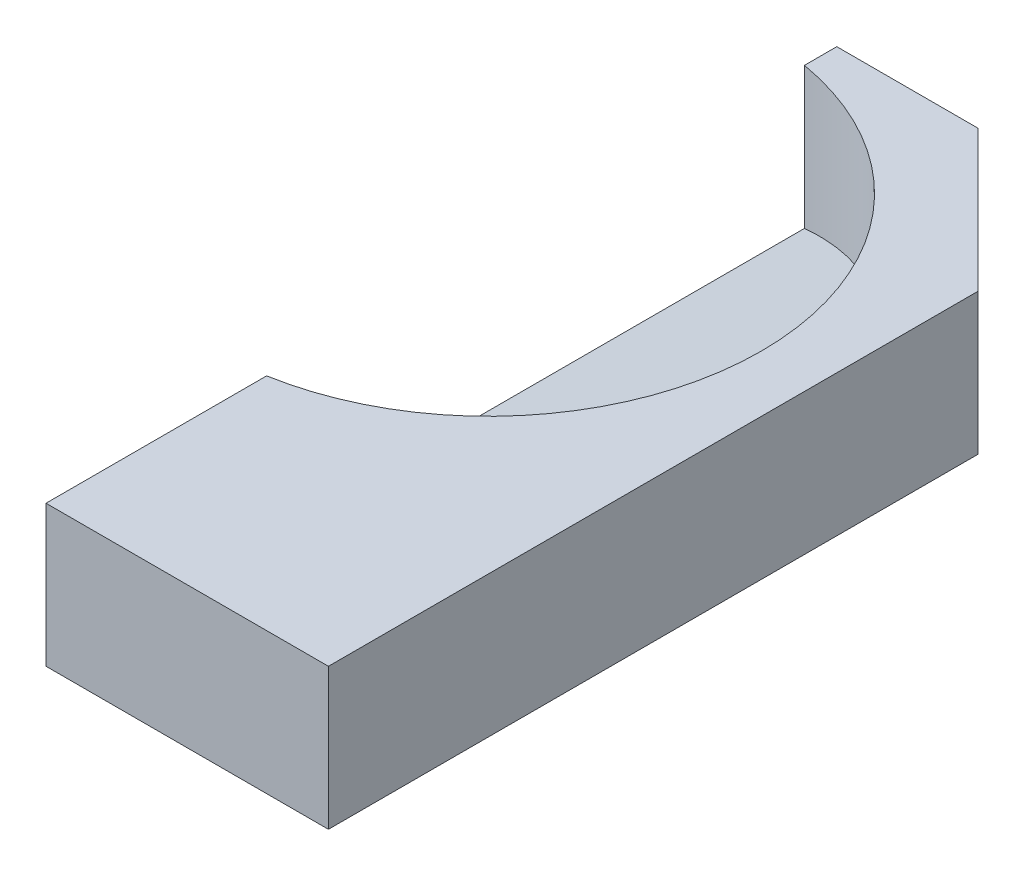
ISO-10303-21;
HEADER;
FILE_DESCRIPTION(('STEP AP214'),'2;1');
FILE_NAME('part.step','',(''),(''),'','','');
FILE_SCHEMA(('AUTOMOTIVE_DESIGN { 1 0 10303 214 1 1 1 1 }'));
ENDSEC;
DATA;
#1=APPLICATION_CONTEXT('core data for automotive mechanical design processes');
#2=APPLICATION_PROTOCOL_DEFINITION('international standard','automotive_design',2000,#1);
#3=PRODUCT_CONTEXT('',#1,'mechanical');
#4=PRODUCT('Part','Part','',(#3));
#5=PRODUCT_RELATED_PRODUCT_CATEGORY('part','',(#4));
#6=PRODUCT_DEFINITION_FORMATION('','',#4);
#7=PRODUCT_DEFINITION_CONTEXT('part definition',#1,'design');
#8=PRODUCT_DEFINITION('design','',#6,#7);
#9=PRODUCT_DEFINITION_SHAPE('','',#8);
#10=(LENGTH_UNIT() NAMED_UNIT(*) SI_UNIT(.MILLI.,.METRE.));
#11=(NAMED_UNIT(*) PLANE_ANGLE_UNIT() SI_UNIT($,.RADIAN.));
#12=(NAMED_UNIT(*) SI_UNIT($,.STERADIAN.) SOLID_ANGLE_UNIT());
#13=UNCERTAINTY_MEASURE_WITH_UNIT(LENGTH_MEASURE(1.E-05),#10,'distance_accuracy_value','');
#14=(GEOMETRIC_REPRESENTATION_CONTEXT(3) GLOBAL_UNCERTAINTY_ASSIGNED_CONTEXT((#13)) GLOBAL_UNIT_ASSIGNED_CONTEXT((#10,
#11,#12)) REPRESENTATION_CONTEXT('',''));
#15=CARTESIAN_POINT('',(0.,0.,0.));
#16=DIRECTION('',(0.,0.,1.));
#17=DIRECTION('',(1.,0.,0.));
#18=AXIS2_PLACEMENT_3D('',#15,#16,#17);
#19=CARTESIAN_POINT('',(-32.4128547970913,15.,-40.7804396814199));
#20=DIRECTION('',(1.,0.,0.));
#21=DIRECTION('',(0.,0.,-1.));
#22=AXIS2_PLACEMENT_3D('',#19,#20,#21);
#23=PLANE('',#22);
#24=DIRECTION('',(0.,1.,0.));
#25=VECTOR('',#24,1.);
#26=CARTESIAN_POINT('',(-32.4128547970913,5.,19.7852740327515));
#27=LINE('',#26,#25);
#28=CARTESIAN_POINT('',(-32.4128547970913,15.,19.7852740327515));
#29=VERTEX_POINT('',#28);
#30=CARTESIAN_POINT('',(-32.4128547970913,0.,19.7852740327515));
#31=VERTEX_POINT('',#30);
#32=EDGE_CURVE('E104',#29,#31,#27,.F.);
#33=ORIENTED_EDGE('',*,*,#32,.T.);
#34=DIRECTION('',(0.,0.,1.));
#35=VECTOR('',#34,1.);
#36=CARTESIAN_POINT('',(-32.4128547970913,0.,-40.7804396814199));
#37=LINE('',#36,#35);
#38=CARTESIAN_POINT('',(-32.4128547970913,0.,43.2195603185801));
#39=VERTEX_POINT('',#38);
#40=EDGE_CURVE('E119',#31,#39,#37,.T.);
#41=ORIENTED_EDGE('',*,*,#40,.T.);
#42=DIRECTION('',(0.,-1.,0.));
#43=VECTOR('',#42,1.);
#44=CARTESIAN_POINT('',(-32.4128547970913,15.,43.2195603185801));
#45=LINE('',#44,#43);
#46=CARTESIAN_POINT('',(-32.4128547970913,15.,43.2195603185801));
#47=VERTEX_POINT('',#46);
#48=EDGE_CURVE('E147',#47,#39,#45,.T.);
#49=ORIENTED_EDGE('',*,*,#48,.F.);
#50=DIRECTION('',(0.,0.,1.));
#51=VECTOR('',#50,1.);
#52=CARTESIAN_POINT('',(-32.4128547970913,15.,-40.7804396814199));
#53=LINE('',#52,#51);
#54=EDGE_CURVE('E126',#29,#47,#53,.T.);
#55=ORIENTED_EDGE('',*,*,#54,.F.);
#56=EDGE_LOOP('',(#33,#41,#49,#55));
#57=FACE_BOUND('',#56,.T.);
#58=ADVANCED_FACE('F33',(#57),#23,.F.);
#59=CARTESIAN_POINT('',(-32.4128547970913,0.,-40.7804396814199));
#60=VERTEX_POINT('',#59);
#61=CARTESIAN_POINT('',(-32.4128547970913,0.,-37.3461533955913));
#62=VERTEX_POINT('',#61);
#63=EDGE_CURVE('E117',#60,#62,#37,.T.);
#64=ORIENTED_EDGE('',*,*,#63,.T.);
#65=DIRECTION('',(0.,1.,0.));
#66=VECTOR('',#65,1.);
#67=CARTESIAN_POINT('',(-32.4128547970913,5.,-37.3461533955913));
#68=LINE('',#67,#66);
#69=CARTESIAN_POINT('',(-32.4128547970913,15.,-37.3461533955913));
#70=VERTEX_POINT('',#69);
#71=EDGE_CURVE('E101',#62,#70,#68,.T.);
#72=ORIENTED_EDGE('',*,*,#71,.T.);
#73=CARTESIAN_POINT('',(-32.4128547970913,15.,-40.7804396814199));
#74=VERTEX_POINT('',#73);
#75=EDGE_CURVE('E115',#74,#70,#53,.T.);
#76=ORIENTED_EDGE('',*,*,#75,.F.);
#77=DIRECTION('',(0.,-1.,0.));
#78=VECTOR('',#77,1.);
#79=CARTESIAN_POINT('',(-32.4128547970913,15.,-40.7804396814199));
#80=LINE('',#79,#78);
#81=EDGE_CURVE('E135',#74,#60,#80,.T.);
#82=ORIENTED_EDGE('',*,*,#81,.T.);
#83=EDGE_LOOP('',(#64,#72,#76,#82));
#84=FACE_BOUND('',#83,.T.);
#85=ADVANCED_FACE('F113',(#84),#23,.F.);
#86=CARTESIAN_POINT('',(-32.4128547970913,15.,43.2195603185801));
#87=DIRECTION('',(0.,0.,-1.));
#88=DIRECTION('',(-1.,0.,0.));
#89=AXIS2_PLACEMENT_3D('',#86,#87,#88);
#90=PLANE('',#89);
#91=DIRECTION('',(1.,0.,0.));
#92=VECTOR('',#91,1.);
#93=CARTESIAN_POINT('',(-32.4128547970913,0.,43.2195603185801));
#94=LINE('',#93,#92);
#95=CARTESIAN_POINT('',(-2.41285479709126,0.,43.2195603185801));
#96=VERTEX_POINT('',#95);
#97=EDGE_CURVE('E137',#39,#96,#94,.T.);
#98=ORIENTED_EDGE('',*,*,#97,.T.);
#99=DIRECTION('',(0.,-1.,0.));
#100=VECTOR('',#99,1.);
#101=CARTESIAN_POINT('',(-2.41285479709126,15.,43.2195603185801));
#102=LINE('',#101,#100);
#103=CARTESIAN_POINT('',(-2.41285479709126,15.,43.2195603185801));
#104=VERTEX_POINT('',#103);
#105=EDGE_CURVE('E144',#104,#96,#102,.T.);
#106=ORIENTED_EDGE('',*,*,#105,.F.);
#107=DIRECTION('',(1.,0.,0.));
#108=VECTOR('',#107,1.);
#109=CARTESIAN_POINT('',(-32.4128547970913,15.,43.2195603185801));
#110=LINE('',#109,#108);
#111=EDGE_CURVE('E125',#47,#104,#110,.T.);
#112=ORIENTED_EDGE('',*,*,#111,.F.);
#113=ORIENTED_EDGE('',*,*,#48,.T.);
#114=EDGE_LOOP('',(#98,#106,#112,#113));
#115=FACE_BOUND('',#114,.T.);
#116=ADVANCED_FACE('F175',(#115),#90,.F.);
#117=CARTESIAN_POINT('',(-2.41285479709127,15.,-40.7804396814199));
#118=DIRECTION('',(-1.,0.,0.));
#119=DIRECTION('',(0.,0.,1.));
#120=AXIS2_PLACEMENT_3D('',#117,#118,#119);
#121=PLANE('',#120);
#122=DIRECTION('',(0.,0.,-1.));
#123=VECTOR('',#122,1.);
#124=CARTESIAN_POINT('',(-2.41285479709127,0.,-40.7804396814199));
#125=LINE('',#124,#123);
#126=CARTESIAN_POINT('',(-2.41285479709127,0.,-25.7804396814199));
#127=VERTEX_POINT('',#126);
#128=EDGE_CURVE('E140',#96,#127,#125,.T.);
#129=ORIENTED_EDGE('',*,*,#128,.T.);
#130=DIRECTION('',(0.,1.,0.));
#131=VECTOR('',#130,1.);
#132=CARTESIAN_POINT('',(-2.41285479709127,15.,-25.7804396814199));
#133=LINE('',#132,#131);
#134=CARTESIAN_POINT('',(-2.41285479709127,15.,-25.7804396814199));
#135=VERTEX_POINT('',#134);
#136=EDGE_CURVE('E41',#127,#135,#133,.T.);
#137=ORIENTED_EDGE('',*,*,#136,.T.);
#138=DIRECTION('',(0.,0.,-1.));
#139=VECTOR('',#138,1.);
#140=CARTESIAN_POINT('',(-2.41285479709127,15.,-40.7804396814199));
#141=LINE('',#140,#139);
#142=EDGE_CURVE('E128',#104,#135,#141,.T.);
#143=ORIENTED_EDGE('',*,*,#142,.F.);
#144=ORIENTED_EDGE('',*,*,#105,.T.);
#145=EDGE_LOOP('',(#129,#137,#143,#144));
#146=FACE_BOUND('',#145,.T.);
#147=ADVANCED_FACE('F189',(#146),#121,.F.);
#148=CARTESIAN_POINT('',(-32.4128547970913,15.,-40.7804396814199));
#149=DIRECTION('',(0.,0.,1.));
#150=DIRECTION('',(1.,0.,0.));
#151=AXIS2_PLACEMENT_3D('',#148,#149,#150);
#152=PLANE('',#151);
#153=DIRECTION('',(-1.,0.,0.));
#154=VECTOR('',#153,1.);
#155=CARTESIAN_POINT('',(-32.4128547970913,15.,-40.7804396814199));
#156=LINE('',#155,#154);
#157=CARTESIAN_POINT('',(-17.4128547970913,15.,-40.7804396814199));
#158=VERTEX_POINT('',#157);
#159=EDGE_CURVE('E123',#158,#74,#156,.T.);
#160=ORIENTED_EDGE('',*,*,#159,.F.);
#161=DIRECTION('',(0.,-1.,0.));
#162=VECTOR('',#161,1.);
#163=CARTESIAN_POINT('',(-17.4128547970913,15.,-40.7804396814199));
#164=LINE('',#163,#162);
#165=CARTESIAN_POINT('',(-17.4128547970913,0.,-40.7804396814199));
#166=VERTEX_POINT('',#165);
#167=EDGE_CURVE('E157',#158,#166,#164,.T.);
#168=ORIENTED_EDGE('',*,*,#167,.T.);
#169=DIRECTION('',(-1.,0.,0.));
#170=VECTOR('',#169,1.);
#171=CARTESIAN_POINT('',(-32.4128547970913,0.,-40.7804396814199));
#172=LINE('',#171,#170);
#173=EDGE_CURVE('E130',#166,#60,#172,.T.);
#174=ORIENTED_EDGE('',*,*,#173,.T.);
#175=ORIENTED_EDGE('',*,*,#81,.F.);
#176=EDGE_LOOP('',(#160,#168,#174,#175));
#177=FACE_BOUND('',#176,.T.);
#178=ADVANCED_FACE('F162',(#177),#152,.F.);
#179=CARTESIAN_POINT('',(0.,15.,0.));
#180=DIRECTION('',(0.,1.,0.));
#181=DIRECTION('',(0.,0.,1.));
#182=AXIS2_PLACEMENT_3D('',#179,#180,#181);
#183=PLANE('',#182);
#184=ORIENTED_EDGE('',*,*,#142,.T.);
#185=DIRECTION('',(0.707106781186546,0.,0.707106781186549));
#186=VECTOR('',#185,1.);
#187=CARTESIAN_POINT('',(11.6837924421643,15.,-11.6837924421643));
#188=LINE('',#187,#186);
#189=EDGE_CURVE('E11',#135,#158,#188,.F.);
#190=ORIENTED_EDGE('',*,*,#189,.T.);
#191=ORIENTED_EDGE('',*,*,#159,.T.);
#192=ORIENTED_EDGE('',*,*,#75,.T.);
#193=CARTESIAN_POINT('',(-37.4128547970913,15.,-8.78043968141991));
#194=DIRECTION('',(0.,1.,0.));
#195=DIRECTION('',(0.,0.,1.));
#196=AXIS2_PLACEMENT_3D('',#193,#194,#195);
#197=CIRCLE('',#196,29.);
#198=EDGE_CURVE('E97',#29,#70,#197,.T.);
#199=ORIENTED_EDGE('',*,*,#198,.F.);
#200=ORIENTED_EDGE('',*,*,#54,.T.);
#201=ORIENTED_EDGE('',*,*,#111,.T.);
#202=EDGE_LOOP('',(#184,#190,#191,#192,#199,#200,#201));
#203=FACE_BOUND('',#202,.T.);
#204=ADVANCED_FACE('F121',(#203),#183,.T.);
#205=CARTESIAN_POINT('',(0.,0.,0.));
#206=DIRECTION('',(0.,1.,0.));
#207=DIRECTION('',(0.,0.,1.));
#208=AXIS2_PLACEMENT_3D('',#205,#206,#207);
#209=PLANE('',#208);
#210=ORIENTED_EDGE('',*,*,#173,.F.);
#211=DIRECTION('',(-0.707106781186546,0.,-0.707106781186549));
#212=VECTOR('',#211,1.);
#213=CARTESIAN_POINT('',(-17.4128547970913,0.,-40.7804396814199));
#214=LINE('',#213,#212);
#215=EDGE_CURVE('E55',#166,#127,#214,.F.);
#216=ORIENTED_EDGE('',*,*,#215,.T.);
#217=ORIENTED_EDGE('',*,*,#128,.F.);
#218=ORIENTED_EDGE('',*,*,#97,.F.);
#219=ORIENTED_EDGE('',*,*,#40,.F.);
#220=EDGE_CURVE('E138',#62,#31,#37,.T.);
#221=ORIENTED_EDGE('',*,*,#220,.F.);
#222=ORIENTED_EDGE('',*,*,#63,.F.);
#223=EDGE_LOOP('',(#210,#216,#217,#218,#219,#221,#222));
#224=FACE_BOUND('',#223,.T.);
#225=ADVANCED_FACE('F165',(#224),#209,.F.);
#226=CARTESIAN_POINT('',(-37.4128547970913,5.,-8.78043968141991));
#227=DIRECTION('',(0.,1.,0.));
#228=DIRECTION('',(0.,0.,1.));
#229=AXIS2_PLACEMENT_3D('',#226,#227,#228);
#230=PLANE('',#229);
#231=CARTESIAN_POINT('',(-37.4128547970913,5.,-8.78043968141991));
#232=DIRECTION('',(0.,1.,0.));
#233=DIRECTION('',(0.,0.,1.));
#234=AXIS2_PLACEMENT_3D('',#231,#232,#233);
#235=CIRCLE('',#234,29.);
#236=CARTESIAN_POINT('',(-12.412854797091,5.,5.91649877527867));
#237=VERTEX_POINT('',#236);
#238=CARTESIAN_POINT('',(-12.412854797091,5.,-23.4773781381185));
#239=VERTEX_POINT('',#238);
#240=EDGE_CURVE('E108',#237,#239,#235,.T.);
#241=ORIENTED_EDGE('',*,*,#240,.T.);
#242=DIRECTION('',(0.,0.,1.));
#243=VECTOR('',#242,1.);
#244=CARTESIAN_POINT('',(-12.412854797091,5.,19.7852740327515));
#245=LINE('',#244,#243);
#246=EDGE_CURVE('E150',#239,#237,#245,.T.);
#247=ORIENTED_EDGE('',*,*,#246,.T.);
#248=EDGE_LOOP('',(#241,#247));
#249=FACE_BOUND('',#248,.T.);
#250=ADVANCED_FACE('F196',(#249),#230,.T.);
#251=CARTESIAN_POINT('',(-37.4128547970913,5.,-8.78043968141991));
#252=DIRECTION('',(0.,1.,0.));
#253=DIRECTION('',(0.,0.,1.));
#254=AXIS2_PLACEMENT_3D('',#251,#252,#253);
#255=CYLINDRICAL_SURFACE('',#254,29.);
#256=ORIENTED_EDGE('',*,*,#240,.F.);
#257=CARTESIAN_POINT('',(-37.4128547970913,-1.25,-8.78043968141991));
#258=DIRECTION('',(-0.24253562503633,0.970142500145333,0.));
#259=DIRECTION('',(0.970142500145333,0.24253562503633,0.));
#260=AXIS2_PLACEMENT_3D('',#257,#258,#259);
#261=ELLIPSE('',#260,29.892515785728,29.);
#262=EDGE_CURVE('E153',#237,#31,#261,.F.);
#263=ORIENTED_EDGE('',*,*,#262,.T.);
#264=ORIENTED_EDGE('',*,*,#32,.F.);
#265=ORIENTED_EDGE('',*,*,#198,.T.);
#266=ORIENTED_EDGE('',*,*,#71,.F.);
#267=CARTESIAN_POINT('',(-37.4128547970913,-1.25,-8.78043968141991));
#268=DIRECTION('',(-0.24253562503633,0.970142500145333,0.));
#269=DIRECTION('',(0.970142500145333,0.24253562503633,0.));
#270=AXIS2_PLACEMENT_3D('',#267,#268,#269);
#271=ELLIPSE('',#270,29.892515785728,29.);
#272=EDGE_CURVE('E155',#62,#239,#271,.F.);
#273=ORIENTED_EDGE('',*,*,#272,.T.);
#274=EDGE_LOOP('',(#256,#263,#264,#265,#266,#273));
#275=FACE_BOUND('',#274,.T.);
#276=ADVANCED_FACE('F100',(#275),#255,.F.);
#277=CARTESIAN_POINT('',(-12.412854797091,5.,-8.78043968141992));
#278=DIRECTION('',(-0.24253562503633,0.970142500145333,0.));
#279=DIRECTION('',(0.,0.,-1.));
#280=AXIS2_PLACEMENT_3D('',#277,#278,#279);
#281=PLANE('',#280);
#282=ORIENTED_EDGE('',*,*,#272,.F.);
#283=ORIENTED_EDGE('',*,*,#220,.T.);
#284=ORIENTED_EDGE('',*,*,#262,.F.);
#285=ORIENTED_EDGE('',*,*,#246,.F.);
#286=EDGE_LOOP('',(#282,#283,#284,#285));
#287=FACE_BOUND('',#286,.T.);
#288=ADVANCED_FACE('F177',(#287),#281,.T.);
#289=CARTESIAN_POINT('',(-17.4128547970913,15.,-40.7804396814199));
#290=DIRECTION('',(-0.707106781186549,0.,0.707106781186546));
#291=DIRECTION('',(0.,-1.,0.));
#292=AXIS2_PLACEMENT_3D('',#289,#290,#291);
#293=PLANE('',#292);
#294=ORIENTED_EDGE('',*,*,#189,.F.);
#295=ORIENTED_EDGE('',*,*,#136,.F.);
#296=ORIENTED_EDGE('',*,*,#215,.F.);
#297=ORIENTED_EDGE('',*,*,#167,.F.);
#298=EDGE_LOOP('',(#294,#295,#296,#297));
#299=FACE_BOUND('',#298,.T.);
#300=ADVANCED_FACE('F35',(#299),#293,.F.);
#301=CLOSED_SHELL('',(#58,#85,#116,#147,#178,#204,#225,#250,#276,#288,#300));
#302=MANIFOLD_SOLID_BREP('B2',#301);
#303=ADVANCED_BREP_SHAPE_REPRESENTATION('',(#18,#302),#14);
#304=SHAPE_DEFINITION_REPRESENTATION(#9,#303);
ENDSEC;
END-ISO-10303-21;
